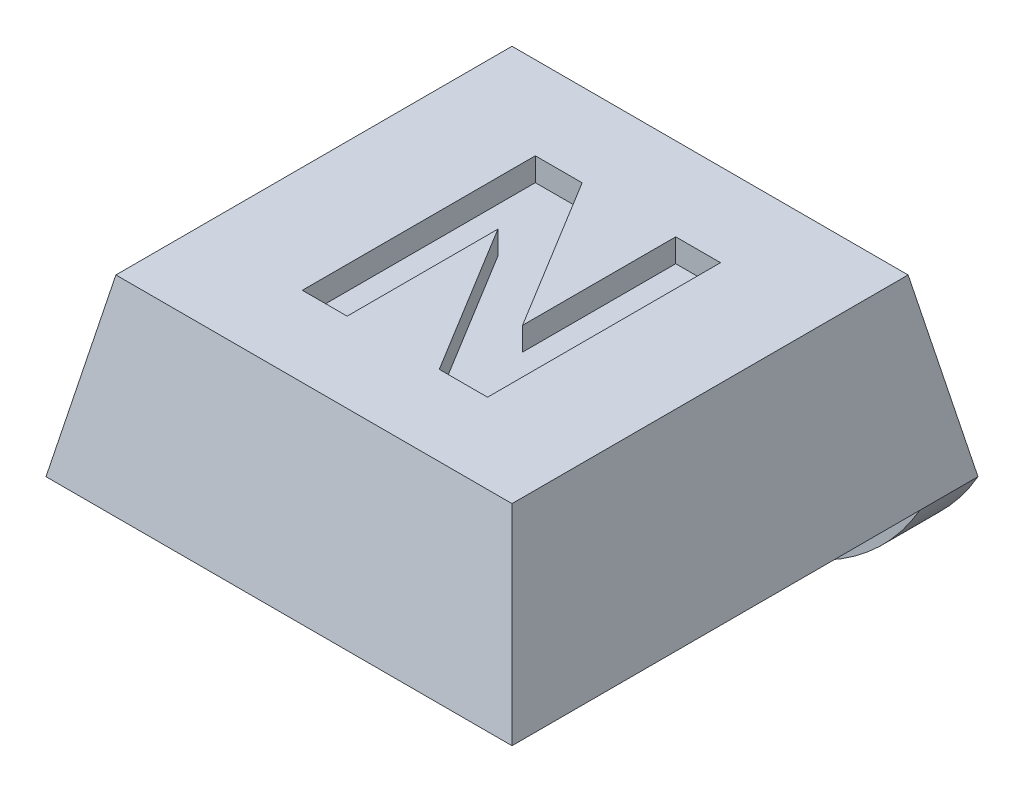
ISO-10303-21;
HEADER;
FILE_DESCRIPTION(('STEP AP214'),'2;1');
FILE_NAME('part.step','',(''),(''),'','','');
FILE_SCHEMA(('AUTOMOTIVE_DESIGN { 1 0 10303 214 1 1 1 1 }'));
ENDSEC;
DATA;
#1=APPLICATION_CONTEXT('core data for automotive mechanical design processes');
#2=APPLICATION_PROTOCOL_DEFINITION('international standard','automotive_design',2000,#1);
#3=PRODUCT_CONTEXT('',#1,'mechanical');
#4=PRODUCT('Part','Part','',(#3));
#5=PRODUCT_RELATED_PRODUCT_CATEGORY('part','',(#4));
#6=PRODUCT_DEFINITION_FORMATION('','',#4);
#7=PRODUCT_DEFINITION_CONTEXT('part definition',#1,'design');
#8=PRODUCT_DEFINITION('design','',#6,#7);
#9=PRODUCT_DEFINITION_SHAPE('','',#8);
#10=(LENGTH_UNIT() NAMED_UNIT(*) SI_UNIT(.MILLI.,.METRE.));
#11=(NAMED_UNIT(*) PLANE_ANGLE_UNIT() SI_UNIT($,.RADIAN.));
#12=(NAMED_UNIT(*) SI_UNIT($,.STERADIAN.) SOLID_ANGLE_UNIT());
#13=UNCERTAINTY_MEASURE_WITH_UNIT(LENGTH_MEASURE(1.E-05),#10,'distance_accuracy_value','');
#14=(GEOMETRIC_REPRESENTATION_CONTEXT(3) GLOBAL_UNCERTAINTY_ASSIGNED_CONTEXT((#13)) GLOBAL_UNIT_ASSIGNED_CONTEXT((#10,
#11,#12)) REPRESENTATION_CONTEXT('',''));
#15=CARTESIAN_POINT('',(0.,0.,0.));
#16=DIRECTION('',(0.,0.,1.));
#17=DIRECTION('',(1.,0.,0.));
#18=AXIS2_PLACEMENT_3D('',#15,#16,#17);
#19=CARTESIAN_POINT('',(0.,3.,0.));
#20=DIRECTION('',(0.,-1.,0.));
#21=DIRECTION('',(0.,0.,-1.));
#22=AXIS2_PLACEMENT_3D('',#19,#20,#21);
#23=PLANE('',#22);
#24=DIRECTION('',(-1.,0.,0.));
#25=VECTOR('',#24,1.);
#26=CARTESIAN_POINT('',(11.,3.,-0.6));
#27=LINE('',#26,#25);
#28=CARTESIAN_POINT('',(7.4,3.,-0.6));
#29=VERTEX_POINT('',#28);
#30=CARTESIAN_POINT('',(0.6,3.,-0.6));
#31=VERTEX_POINT('',#30);
#32=EDGE_CURVE('E217',#29,#31,#27,.T.);
#33=ORIENTED_EDGE('',*,*,#32,.F.);
#34=DIRECTION('',(0.,0.,1.));
#35=VECTOR('',#34,1.);
#36=CARTESIAN_POINT('',(7.4,3.,-8.));
#37=LINE('',#36,#35);
#38=CARTESIAN_POINT('',(7.4,3.,-7.4));
#39=VERTEX_POINT('',#38);
#40=EDGE_CURVE('E230',#39,#29,#37,.T.);
#41=ORIENTED_EDGE('',*,*,#40,.F.);
#42=DIRECTION('',(-1.,0.,0.));
#43=VECTOR('',#42,1.);
#44=CARTESIAN_POINT('',(11.,3.,-7.4));
#45=LINE('',#44,#43);
#46=CARTESIAN_POINT('',(0.599999999999999,3.,-7.4));
#47=VERTEX_POINT('',#46);
#48=EDGE_CURVE('E213',#39,#47,#45,.T.);
#49=ORIENTED_EDGE('',*,*,#48,.T.);
#50=DIRECTION('',(0.,0.,1.));
#51=VECTOR('',#50,1.);
#52=CARTESIAN_POINT('',(0.6,3.,-8.));
#53=LINE('',#52,#51);
#54=EDGE_CURVE('E233',#47,#31,#53,.T.);
#55=ORIENTED_EDGE('',*,*,#54,.T.);
#56=EDGE_LOOP('',(#33,#41,#49,#55));
#57=FACE_BOUND('',#56,.T.);
#58=DIRECTION('',(-1.,0.,0.));
#59=VECTOR('',#58,1.);
#60=CARTESIAN_POINT('',(3.19779277736189,3.,-1.9720128589146));
#61=LINE('',#60,#59);
#62=CARTESIAN_POINT('',(3.19779277736189,3.,-1.9720128589146));
#63=VERTEX_POINT('',#62);
#64=CARTESIAN_POINT('',(2.42856200813112,3.,-1.9720128589146));
#65=VERTEX_POINT('',#64);
#66=EDGE_CURVE('E58',#63,#65,#61,.T.);
#67=ORIENTED_EDGE('',*,*,#66,.T.);
#68=DIRECTION('',(0.,0.,-1.));
#69=VECTOR('',#68,1.);
#70=CARTESIAN_POINT('',(2.42856200813112,3.,-1.9720128589146));
#71=LINE('',#70,#69);
#72=CARTESIAN_POINT('',(2.42856200813112,3.,-5.9720128589146));
#73=VERTEX_POINT('',#72);
#74=EDGE_CURVE('E185',#65,#73,#71,.T.);
#75=ORIENTED_EDGE('',*,*,#74,.T.);
#76=DIRECTION('',(1.,0.,0.));
#77=VECTOR('',#76,1.);
#78=CARTESIAN_POINT('',(2.42856200813112,3.,-5.9720128589146));
#79=LINE('',#78,#77);
#80=CARTESIAN_POINT('',(3.23224790556701,3.,-5.9720128589146));
#81=VERTEX_POINT('',#80);
#82=EDGE_CURVE('E624',#73,#81,#79,.T.);
#83=ORIENTED_EDGE('',*,*,#82,.T.);
#84=DIRECTION('',(0.521323795742145,0.,0.853358951434274));
#85=VECTOR('',#84,1.);
#86=CARTESIAN_POINT('',(3.23224790556701,3.,-5.9720128589146));
#87=LINE('',#86,#85);
#88=CARTESIAN_POINT('',(4.83881841838753,3.,-3.34220516660691));
#89=VERTEX_POINT('',#88);
#90=EDGE_CURVE('E626',#81,#89,#87,.T.);
#91=ORIENTED_EDGE('',*,*,#90,.T.);
#92=DIRECTION('',(0.,0.,-1.));
#93=VECTOR('',#92,1.);
#94=CARTESIAN_POINT('',(4.83881841838753,3.,-3.34220516660691));
#95=LINE('',#94,#93);
#96=CARTESIAN_POINT('',(4.83881841838753,3.,-5.9720128589146));
#97=VERTEX_POINT('',#96);
#98=EDGE_CURVE('E631',#89,#97,#95,.T.);
#99=ORIENTED_EDGE('',*,*,#98,.T.);
#100=DIRECTION('',(1.,0.,0.));
#101=VECTOR('',#100,1.);
#102=CARTESIAN_POINT('',(4.83881841838753,3.,-5.9720128589146));
#103=LINE('',#102,#101);
#104=CARTESIAN_POINT('',(5.6080491876183,3.,-5.9720128589146));
#105=VERTEX_POINT('',#104);
#106=EDGE_CURVE('E641',#97,#105,#103,.T.);
#107=ORIENTED_EDGE('',*,*,#106,.T.);
#108=DIRECTION('',(0.,0.,1.));
#109=VECTOR('',#108,1.);
#110=CARTESIAN_POINT('',(5.6080491876183,3.,-5.9720128589146));
#111=LINE('',#110,#109);
#112=CARTESIAN_POINT('',(5.6080491876183,3.,-1.9720128589146));
#113=VERTEX_POINT('',#112);
#114=EDGE_CURVE('E596',#105,#113,#111,.T.);
#115=ORIENTED_EDGE('',*,*,#114,.T.);
#116=DIRECTION('',(-1.,0.,0.));
#117=VECTOR('',#116,1.);
#118=CARTESIAN_POINT('',(5.6080491876183,3.,-1.9720128589146));
#119=LINE('',#118,#117);
#120=CARTESIAN_POINT('',(4.77952354659266,3.,-1.9720128589146));
#121=VERTEX_POINT('',#120);
#122=EDGE_CURVE('E591',#113,#121,#119,.T.);
#123=ORIENTED_EDGE('',*,*,#122,.T.);
#124=DIRECTION('',(-0.521471380338423,0.,-0.853268773299445));
#125=VECTOR('',#124,1.);
#126=CARTESIAN_POINT('',(4.77952354659266,3.,-1.9720128589146));
#127=LINE('',#126,#125);
#128=CARTESIAN_POINT('',(3.19779277736189,3.,-4.56015388455563));
#129=VERTEX_POINT('',#128);
#130=EDGE_CURVE('E585',#121,#129,#127,.T.);
#131=ORIENTED_EDGE('',*,*,#130,.T.);
#132=DIRECTION('',(0.,0.,1.));
#133=VECTOR('',#132,1.);
#134=CARTESIAN_POINT('',(3.19779277736189,3.,-4.56015388455563));
#135=LINE('',#134,#133);
#136=EDGE_CURVE('E181',#129,#63,#135,.T.);
#137=ORIENTED_EDGE('',*,*,#136,.T.);
#138=EDGE_LOOP('',(#67,#75,#83,#91,#99,#107,#115,#123,#131,#137));
#139=FACE_BOUND('',#138,.T.);
#140=ADVANCED_FACE('F42',(#57,#139),#23,.F.);
#141=CARTESIAN_POINT('',(8.,0.,-8.));
#142=DIRECTION('',(-0.98058067569092,-0.196116135138184,0.));
#143=DIRECTION('',(0.196116135138184,-0.98058067569092,0.));
#144=AXIS2_PLACEMENT_3D('',#141,#142,#143);
#145=PLANE('',#144);
#146=DIRECTION('',(-0.192450089729875,0.962250448649376,-0.192450089729875));
#147=VECTOR('',#146,1.);
#148=CARTESIAN_POINT('',(7.7037037037037,1.48148148148148,-0.296296296296296));
#149=LINE('',#148,#147);
#150=CARTESIAN_POINT('',(8.,0.,0.));
#151=VERTEX_POINT('',#150);
#152=EDGE_CURVE('E227',#151,#29,#149,.T.);
#153=ORIENTED_EDGE('',*,*,#152,.F.);
#154=DIRECTION('',(0.,0.,-1.));
#155=VECTOR('',#154,1.);
#156=CARTESIAN_POINT('',(8.,0.,0.));
#157=LINE('',#156,#155);
#158=CARTESIAN_POINT('',(8.,0.,-7.));
#159=VERTEX_POINT('',#158);
#160=EDGE_CURVE('E246',#151,#159,#157,.T.);
#161=ORIENTED_EDGE('',*,*,#160,.T.);
#162=DIRECTION('',(0.,0.,1.));
#163=VECTOR('',#162,1.);
#164=CARTESIAN_POINT('',(8.,0.,-8.));
#165=LINE('',#164,#163);
#166=CARTESIAN_POINT('',(8.,0.,-8.));
#167=VERTEX_POINT('',#166);
#168=EDGE_CURVE('E187',#167,#159,#165,.T.);
#169=ORIENTED_EDGE('',*,*,#168,.F.);
#170=DIRECTION('',(0.192450089729875,-0.962250448649376,-0.192450089729875));
#171=VECTOR('',#170,1.);
#172=CARTESIAN_POINT('',(8.,0.,-8.));
#173=LINE('',#172,#171);
#174=EDGE_CURVE('E220',#39,#167,#173,.T.);
#175=ORIENTED_EDGE('',*,*,#174,.F.);
#176=ORIENTED_EDGE('',*,*,#40,.T.);
#177=EDGE_LOOP('',(#153,#161,#169,#175,#176));
#178=FACE_BOUND('',#177,.T.);
#179=ADVANCED_FACE('F314',(#178),#145,.F.);
#180=CARTESIAN_POINT('',(0.,0.,-8.));
#181=DIRECTION('',(0.98058067569092,-0.196116135138184,0.));
#182=DIRECTION('',(0.196116135138184,0.98058067569092,0.));
#183=AXIS2_PLACEMENT_3D('',#180,#181,#182);
#184=PLANE('',#183);
#185=DIRECTION('',(-0.192450089729875,-0.962250448649376,0.192450089729875));
#186=VECTOR('',#185,1.);
#187=CARTESIAN_POINT('',(0.296296296296296,1.48148148148148,-0.296296296296296));
#188=LINE('',#187,#186);
#189=CARTESIAN_POINT('',(0.,0.,0.));
#190=VERTEX_POINT('',#189);
#191=EDGE_CURVE('E274',#31,#190,#188,.T.);
#192=ORIENTED_EDGE('',*,*,#191,.F.);
#193=ORIENTED_EDGE('',*,*,#54,.F.);
#194=DIRECTION('',(0.192450089729875,0.962250448649376,0.192450089729875));
#195=VECTOR('',#194,1.);
#196=CARTESIAN_POINT('',(0.,0.,-8.));
#197=LINE('',#196,#195);
#198=CARTESIAN_POINT('',(0.,0.,-8.));
#199=VERTEX_POINT('',#198);
#200=EDGE_CURVE('E245',#199,#47,#197,.T.);
#201=ORIENTED_EDGE('',*,*,#200,.F.);
#202=DIRECTION('',(0.,0.,1.));
#203=VECTOR('',#202,1.);
#204=CARTESIAN_POINT('',(0.,0.,0.));
#205=LINE('',#204,#203);
#206=CARTESIAN_POINT('',(0.,0.,-7.));
#207=VERTEX_POINT('',#206);
#208=EDGE_CURVE('E250',#199,#207,#205,.T.);
#209=ORIENTED_EDGE('',*,*,#208,.T.);
#210=EDGE_CURVE('E237',#207,#190,#205,.T.);
#211=ORIENTED_EDGE('',*,*,#210,.T.);
#212=EDGE_LOOP('',(#192,#193,#201,#209,#211));
#213=FACE_BOUND('',#212,.T.);
#214=ADVANCED_FACE('F298',(#213),#184,.F.);
#215=CARTESIAN_POINT('',(0.,0.,0.));
#216=DIRECTION('',(0.,-1.,0.));
#217=DIRECTION('',(0.,0.,-1.));
#218=AXIS2_PLACEMENT_3D('',#215,#216,#217);
#219=PLANE('',#218);
#220=DIRECTION('',(-1.,0.,0.));
#221=VECTOR('',#220,1.);
#222=CARTESIAN_POINT('',(0.,0.,-7.));
#223=LINE('',#222,#221);
#224=EDGE_CURVE('E193',#159,#207,#223,.T.);
#225=ORIENTED_EDGE('',*,*,#224,.F.);
#226=ORIENTED_EDGE('',*,*,#160,.F.);
#227=DIRECTION('',(1.,0.,0.));
#228=VECTOR('',#227,1.);
#229=CARTESIAN_POINT('',(0.,0.,0.));
#230=LINE('',#229,#228);
#231=EDGE_CURVE('E247',#190,#151,#230,.T.);
#232=ORIENTED_EDGE('',*,*,#231,.F.);
#233=ORIENTED_EDGE('',*,*,#210,.F.);
#234=EDGE_LOOP('',(#225,#226,#232,#233));
#235=FACE_BOUND('',#234,.T.);
#236=CARTESIAN_POINT('',(4.,0.,-3.75));
#237=DIRECTION('',(0.,-1.,0.));
#238=DIRECTION('',(0.,0.,-1.));
#239=AXIS2_PLACEMENT_3D('',#236,#237,#238);
#240=CIRCLE('',#239,1.8);
#241=CARTESIAN_POINT('',(4.,0.,-5.55));
#242=VERTEX_POINT('',#241);
#243=EDGE_CURVE('E205',#242,#242,#240,.T.);
#244=ORIENTED_EDGE('',*,*,#243,.F.);
#245=EDGE_LOOP('',(#244));
#246=FACE_BOUND('',#245,.T.);
#247=ADVANCED_FACE('F309',(#235,#246),#219,.T.);
#248=CARTESIAN_POINT('',(11.,3.,-7.4));
#249=DIRECTION('',(0.,0.196116135138184,-0.98058067569092));
#250=DIRECTION('',(0.,0.98058067569092,0.196116135138184));
#251=AXIS2_PLACEMENT_3D('',#248,#249,#250);
#252=PLANE('',#251);
#253=ORIENTED_EDGE('',*,*,#174,.T.);
#254=DIRECTION('',(-1.,0.,0.));
#255=VECTOR('',#254,1.);
#256=CARTESIAN_POINT('',(0.,0.,-8.));
#257=LINE('',#256,#255);
#258=EDGE_CURVE('E241',#167,#199,#257,.T.);
#259=ORIENTED_EDGE('',*,*,#258,.T.);
#260=ORIENTED_EDGE('',*,*,#200,.T.);
#261=ORIENTED_EDGE('',*,*,#48,.F.);
#262=EDGE_LOOP('',(#253,#259,#260,#261));
#263=FACE_BOUND('',#262,.T.);
#264=ADVANCED_FACE('F293',(#263),#252,.T.);
#265=CARTESIAN_POINT('',(11.,0.,0.));
#266=DIRECTION('',(0.,0.196116135138184,0.98058067569092));
#267=DIRECTION('',(0.,-0.98058067569092,0.196116135138184));
#268=AXIS2_PLACEMENT_3D('',#265,#266,#267);
#269=PLANE('',#268);
#270=ORIENTED_EDGE('',*,*,#152,.T.);
#271=ORIENTED_EDGE('',*,*,#32,.T.);
#272=ORIENTED_EDGE('',*,*,#191,.T.);
#273=ORIENTED_EDGE('',*,*,#231,.T.);
#274=EDGE_LOOP('',(#270,#271,#272,#273));
#275=FACE_BOUND('',#274,.T.);
#276=ADVANCED_FACE('F340',(#275),#269,.T.);
#277=CARTESIAN_POINT('',(4.,0.8,-3.75));
#278=DIRECTION('',(0.,-1.,0.));
#279=DIRECTION('',(0.,0.,-1.));
#280=AXIS2_PLACEMENT_3D('',#277,#278,#279);
#281=CYLINDRICAL_SURFACE('',#280,1.8);
#282=CARTESIAN_POINT('',(4.,0.8,-3.75));
#283=DIRECTION('',(0.,-1.,0.));
#284=DIRECTION('',(0.,0.,-1.));
#285=AXIS2_PLACEMENT_3D('',#282,#283,#284);
#286=CIRCLE('',#285,1.8);
#287=CARTESIAN_POINT('',(4.,0.8,-5.55));
#288=VERTEX_POINT('',#287);
#289=EDGE_CURVE('E209',#288,#288,#286,.T.);
#290=ORIENTED_EDGE('',*,*,#289,.F.);
#291=EDGE_LOOP('',(#290));
#292=FACE_BOUND('',#291,.T.);
#293=ORIENTED_EDGE('',*,*,#243,.T.);
#294=EDGE_LOOP('',(#293));
#295=FACE_BOUND('',#294,.T.);
#296=ADVANCED_FACE('F347',(#292,#295),#281,.F.);
#297=CARTESIAN_POINT('',(4.,0.8,-3.75));
#298=DIRECTION('',(0.,-1.,0.));
#299=DIRECTION('',(0.,0.,-1.));
#300=AXIS2_PLACEMENT_3D('',#297,#298,#299);
#301=PLANE('',#300);
#302=ORIENTED_EDGE('',*,*,#289,.T.);
#303=EDGE_LOOP('',(#302));
#304=FACE_BOUND('',#303,.T.);
#305=ADVANCED_FACE('F351',(#304),#301,.T.);
#306=CARTESIAN_POINT('',(0.,-2.,-8.));
#307=DIRECTION('',(0.,0.,1.));
#308=DIRECTION('',(1.,0.,0.));
#309=AXIS2_PLACEMENT_3D('',#306,#307,#308);
#310=PLANE('',#309);
#311=ORIENTED_EDGE('',*,*,#258,.F.);
#312=CARTESIAN_POINT('',(4.53589838486225,2.,-8.));
#313=DIRECTION('',(0.,0.,1.));
#314=DIRECTION('',(1.,0.,0.));
#315=AXIS2_PLACEMENT_3D('',#312,#313,#314);
#316=CIRCLE('',#315,4.);
#317=CARTESIAN_POINT('',(4.53589838486225,-2.,-8.));
#318=VERTEX_POINT('',#317);
#319=EDGE_CURVE('E11',#167,#318,#316,.F.);
#320=ORIENTED_EDGE('',*,*,#319,.T.);
#321=DIRECTION('',(1.,0.,0.));
#322=VECTOR('',#321,1.);
#323=CARTESIAN_POINT('',(0.,-2.,-8.));
#324=LINE('',#323,#322);
#325=CARTESIAN_POINT('',(3.46410161513775,-2.,-8.));
#326=VERTEX_POINT('',#325);
#327=EDGE_CURVE('E199',#326,#318,#324,.T.);
#328=ORIENTED_EDGE('',*,*,#327,.F.);
#329=CARTESIAN_POINT('',(3.46410161513775,2.,-8.));
#330=DIRECTION('',(0.,0.,1.));
#331=DIRECTION('',(1.,0.,0.));
#332=AXIS2_PLACEMENT_3D('',#329,#330,#331);
#333=CIRCLE('',#332,4.);
#334=EDGE_CURVE('E51',#326,#199,#333,.F.);
#335=ORIENTED_EDGE('',*,*,#334,.T.);
#336=EDGE_LOOP('',(#311,#320,#328,#335));
#337=FACE_BOUND('',#336,.T.);
#338=ADVANCED_FACE('F286',(#337),#310,.F.);
#339=CARTESIAN_POINT('',(0.,-2.,-7.));
#340=DIRECTION('',(0.,0.,-1.));
#341=DIRECTION('',(-1.,0.,0.));
#342=AXIS2_PLACEMENT_3D('',#339,#340,#341);
#343=PLANE('',#342);
#344=DIRECTION('',(-1.,0.,0.));
#345=VECTOR('',#344,1.);
#346=CARTESIAN_POINT('',(0.,-2.,-7.));
#347=LINE('',#346,#345);
#348=CARTESIAN_POINT('',(4.53589838486225,-2.,-7.));
#349=VERTEX_POINT('',#348);
#350=CARTESIAN_POINT('',(3.46410161513775,-2.,-7.));
#351=VERTEX_POINT('',#350);
#352=EDGE_CURVE('E203',#349,#351,#347,.T.);
#353=ORIENTED_EDGE('',*,*,#352,.F.);
#354=CARTESIAN_POINT('',(4.53589838486225,2.,-7.));
#355=DIRECTION('',(0.,0.,-1.));
#356=DIRECTION('',(-1.,0.,0.));
#357=AXIS2_PLACEMENT_3D('',#354,#355,#356);
#358=CIRCLE('',#357,4.);
#359=EDGE_CURVE('E280',#349,#159,#358,.F.);
#360=ORIENTED_EDGE('',*,*,#359,.T.);
#361=ORIENTED_EDGE('',*,*,#224,.T.);
#362=CARTESIAN_POINT('',(3.46410161513775,2.,-7.));
#363=DIRECTION('',(0.,0.,-1.));
#364=DIRECTION('',(-1.,0.,0.));
#365=AXIS2_PLACEMENT_3D('',#362,#363,#364);
#366=CIRCLE('',#365,4.);
#367=EDGE_CURVE('E66',#207,#351,#366,.F.);
#368=ORIENTED_EDGE('',*,*,#367,.T.);
#369=EDGE_LOOP('',(#353,#360,#361,#368));
#370=FACE_BOUND('',#369,.T.);
#371=ADVANCED_FACE('F304',(#370),#343,.F.);
#372=CARTESIAN_POINT('',(0.,-2.,0.));
#373=DIRECTION('',(0.,1.,0.));
#374=DIRECTION('',(0.,0.,1.));
#375=AXIS2_PLACEMENT_3D('',#372,#373,#374);
#376=PLANE('',#375);
#377=ORIENTED_EDGE('',*,*,#327,.T.);
#378=DIRECTION('',(0.,0.,1.));
#379=VECTOR('',#378,1.);
#380=CARTESIAN_POINT('',(4.53589838486225,-2.,0.));
#381=LINE('',#380,#379);
#382=EDGE_CURVE('E273',#318,#349,#381,.T.);
#383=ORIENTED_EDGE('',*,*,#382,.T.);
#384=ORIENTED_EDGE('',*,*,#352,.T.);
#385=DIRECTION('',(0.,0.,-1.));
#386=VECTOR('',#385,1.);
#387=CARTESIAN_POINT('',(3.46410161513775,-2.,0.));
#388=LINE('',#387,#386);
#389=EDGE_CURVE('E269',#351,#326,#388,.T.);
#390=ORIENTED_EDGE('',*,*,#389,.T.);
#391=EDGE_LOOP('',(#377,#383,#384,#390));
#392=FACE_BOUND('',#391,.T.);
#393=ADVANCED_FACE('F302',(#392),#376,.F.);
#394=CARTESIAN_POINT('',(4.53589838486225,2.,-8.));
#395=DIRECTION('',(0.,0.,1.));
#396=DIRECTION('',(1.,0.,0.));
#397=AXIS2_PLACEMENT_3D('',#394,#395,#396);
#398=CYLINDRICAL_SURFACE('',#397,4.);
#399=ORIENTED_EDGE('',*,*,#319,.F.);
#400=ORIENTED_EDGE('',*,*,#168,.T.);
#401=ORIENTED_EDGE('',*,*,#359,.F.);
#402=ORIENTED_EDGE('',*,*,#382,.F.);
#403=EDGE_LOOP('',(#399,#400,#401,#402));
#404=FACE_BOUND('',#403,.T.);
#405=ADVANCED_FACE('F315',(#404),#398,.T.);
#406=CARTESIAN_POINT('',(3.46410161513775,2.,-8.));
#407=DIRECTION('',(0.,0.,-1.));
#408=DIRECTION('',(-1.,0.,0.));
#409=AXIS2_PLACEMENT_3D('',#406,#407,#408);
#410=CYLINDRICAL_SURFACE('',#409,4.);
#411=ORIENTED_EDGE('',*,*,#367,.F.);
#412=ORIENTED_EDGE('',*,*,#208,.F.);
#413=ORIENTED_EDGE('',*,*,#334,.F.);
#414=ORIENTED_EDGE('',*,*,#389,.F.);
#415=EDGE_LOOP('',(#411,#412,#413,#414));
#416=FACE_BOUND('',#415,.T.);
#417=ADVANCED_FACE('F44',(#416),#410,.T.);
#418=CARTESIAN_POINT('',(3.19779277736189,2.6,-1.9720128589146));
#419=DIRECTION('',(0.,0.,-1.));
#420=DIRECTION('',(-1.,0.,0.));
#421=AXIS2_PLACEMENT_3D('',#418,#419,#420);
#422=PLANE('',#421);
#423=ORIENTED_EDGE('',*,*,#66,.F.);
#424=DIRECTION('',(0.,1.,0.));
#425=VECTOR('',#424,1.);
#426=CARTESIAN_POINT('',(3.19779277736189,2.6,-1.9720128589146));
#427=LINE('',#426,#425);
#428=CARTESIAN_POINT('',(3.19779277736189,2.6,-1.9720128589146));
#429=VERTEX_POINT('',#428);
#430=EDGE_CURVE('E179',#429,#63,#427,.T.);
#431=ORIENTED_EDGE('',*,*,#430,.F.);
#432=DIRECTION('',(-1.,0.,0.));
#433=VECTOR('',#432,1.);
#434=CARTESIAN_POINT('',(3.19779277736189,2.6,-1.9720128589146));
#435=LINE('',#434,#433);
#436=CARTESIAN_POINT('',(2.42856200813112,2.6,-1.9720128589146));
#437=VERTEX_POINT('',#436);
#438=EDGE_CURVE('E169',#429,#437,#435,.T.);
#439=ORIENTED_EDGE('',*,*,#438,.T.);
#440=DIRECTION('',(0.,1.,0.));
#441=VECTOR('',#440,1.);
#442=CARTESIAN_POINT('',(2.42856200813112,2.6,-1.9720128589146));
#443=LINE('',#442,#441);
#444=EDGE_CURVE('E178',#437,#65,#443,.T.);
#445=ORIENTED_EDGE('',*,*,#444,.T.);
#446=EDGE_LOOP('',(#423,#431,#439,#445));
#447=FACE_BOUND('',#446,.T.);
#448=ADVANCED_FACE('F177',(#447),#422,.T.);
#449=CARTESIAN_POINT('',(2.42856200813112,2.6,-1.9720128589146));
#450=DIRECTION('',(1.,0.,0.));
#451=DIRECTION('',(0.,0.,-1.));
#452=AXIS2_PLACEMENT_3D('',#449,#450,#451);
#453=PLANE('',#452);
#454=ORIENTED_EDGE('',*,*,#74,.F.);
#455=ORIENTED_EDGE('',*,*,#444,.F.);
#456=DIRECTION('',(0.,0.,-1.));
#457=VECTOR('',#456,1.);
#458=CARTESIAN_POINT('',(2.42856200813112,2.6,-1.9720128589146));
#459=LINE('',#458,#457);
#460=CARTESIAN_POINT('',(2.42856200813112,2.6,-5.9720128589146));
#461=VERTEX_POINT('',#460);
#462=EDGE_CURVE('E165',#437,#461,#459,.T.);
#463=ORIENTED_EDGE('',*,*,#462,.T.);
#464=DIRECTION('',(0.,1.,0.));
#465=VECTOR('',#464,1.);
#466=CARTESIAN_POINT('',(2.42856200813112,2.6,-5.9720128589146));
#467=LINE('',#466,#465);
#468=EDGE_CURVE('E188',#461,#73,#467,.T.);
#469=ORIENTED_EDGE('',*,*,#468,.T.);
#470=EDGE_LOOP('',(#454,#455,#463,#469));
#471=FACE_BOUND('',#470,.T.);
#472=ADVANCED_FACE('F183',(#471),#453,.T.);
#473=CARTESIAN_POINT('',(2.42856200813112,2.6,-5.9720128589146));
#474=DIRECTION('',(0.,0.,1.));
#475=DIRECTION('',(1.,0.,0.));
#476=AXIS2_PLACEMENT_3D('',#473,#474,#475);
#477=PLANE('',#476);
#478=ORIENTED_EDGE('',*,*,#82,.F.);
#479=ORIENTED_EDGE('',*,*,#468,.F.);
#480=DIRECTION('',(1.,0.,0.));
#481=VECTOR('',#480,1.);
#482=CARTESIAN_POINT('',(2.42856200813112,2.6,-5.9720128589146));
#483=LINE('',#482,#481);
#484=CARTESIAN_POINT('',(3.23224790556701,2.6,-5.9720128589146));
#485=VERTEX_POINT('',#484);
#486=EDGE_CURVE('E171',#461,#485,#483,.T.);
#487=ORIENTED_EDGE('',*,*,#486,.T.);
#488=DIRECTION('',(0.,1.,0.));
#489=VECTOR('',#488,1.);
#490=CARTESIAN_POINT('',(3.23224790556701,2.6,-5.9720128589146));
#491=LINE('',#490,#489);
#492=EDGE_CURVE('E195',#485,#81,#491,.T.);
#493=ORIENTED_EDGE('',*,*,#492,.T.);
#494=EDGE_LOOP('',(#478,#479,#487,#493));
#495=FACE_BOUND('',#494,.T.);
#496=ADVANCED_FACE('F364',(#495),#477,.T.);
#497=CARTESIAN_POINT('',(3.23224790556701,2.6,-5.9720128589146));
#498=DIRECTION('',(-0.853358951434274,0.,0.521323795742145));
#499=DIRECTION('',(0.521323795742145,0.,0.853358951434274));
#500=AXIS2_PLACEMENT_3D('',#497,#498,#499);
#501=PLANE('',#500);
#502=ORIENTED_EDGE('',*,*,#90,.F.);
#503=ORIENTED_EDGE('',*,*,#492,.F.);
#504=DIRECTION('',(0.521323795742145,0.,0.853358951434274));
#505=VECTOR('',#504,1.);
#506=CARTESIAN_POINT('',(3.23224790556701,2.6,-5.9720128589146));
#507=LINE('',#506,#505);
#508=CARTESIAN_POINT('',(4.83881841838753,2.6,-3.34220516660691));
#509=VERTEX_POINT('',#508);
#510=EDGE_CURVE('E671',#485,#509,#507,.T.);
#511=ORIENTED_EDGE('',*,*,#510,.T.);
#512=DIRECTION('',(0.,1.,0.));
#513=VECTOR('',#512,1.);
#514=CARTESIAN_POINT('',(4.83881841838753,2.6,-3.34220516660691));
#515=LINE('',#514,#513);
#516=EDGE_CURVE('E617',#509,#89,#515,.T.);
#517=ORIENTED_EDGE('',*,*,#516,.T.);
#518=EDGE_LOOP('',(#502,#503,#511,#517));
#519=FACE_BOUND('',#518,.T.);
#520=ADVANCED_FACE('F367',(#519),#501,.T.);
#521=CARTESIAN_POINT('',(4.83881841838753,2.6,-3.34220516660691));
#522=DIRECTION('',(1.,0.,0.));
#523=DIRECTION('',(0.,0.,-1.));
#524=AXIS2_PLACEMENT_3D('',#521,#522,#523);
#525=PLANE('',#524);
#526=ORIENTED_EDGE('',*,*,#98,.F.);
#527=ORIENTED_EDGE('',*,*,#516,.F.);
#528=DIRECTION('',(0.,0.,-1.));
#529=VECTOR('',#528,1.);
#530=CARTESIAN_POINT('',(4.83881841838753,2.6,-3.34220516660691));
#531=LINE('',#530,#529);
#532=CARTESIAN_POINT('',(4.83881841838753,2.6,-5.9720128589146));
#533=VERTEX_POINT('',#532);
#534=EDGE_CURVE('E668',#509,#533,#531,.T.);
#535=ORIENTED_EDGE('',*,*,#534,.T.);
#536=DIRECTION('',(0.,1.,0.));
#537=VECTOR('',#536,1.);
#538=CARTESIAN_POINT('',(4.83881841838753,2.6,-5.9720128589146));
#539=LINE('',#538,#537);
#540=EDGE_CURVE('E614',#533,#97,#539,.T.);
#541=ORIENTED_EDGE('',*,*,#540,.T.);
#542=EDGE_LOOP('',(#526,#527,#535,#541));
#543=FACE_BOUND('',#542,.T.);
#544=ADVANCED_FACE('F371',(#543),#525,.T.);
#545=CARTESIAN_POINT('',(4.83881841838753,2.6,-5.9720128589146));
#546=DIRECTION('',(0.,0.,1.));
#547=DIRECTION('',(1.,0.,0.));
#548=AXIS2_PLACEMENT_3D('',#545,#546,#547);
#549=PLANE('',#548);
#550=ORIENTED_EDGE('',*,*,#106,.F.);
#551=ORIENTED_EDGE('',*,*,#540,.F.);
#552=DIRECTION('',(1.,0.,0.));
#553=VECTOR('',#552,1.);
#554=CARTESIAN_POINT('',(4.83881841838753,2.6,-5.9720128589146));
#555=LINE('',#554,#553);
#556=CARTESIAN_POINT('',(5.6080491876183,2.6,-5.9720128589146));
#557=VERTEX_POINT('',#556);
#558=EDGE_CURVE('E665',#533,#557,#555,.T.);
#559=ORIENTED_EDGE('',*,*,#558,.T.);
#560=DIRECTION('',(0.,1.,0.));
#561=VECTOR('',#560,1.);
#562=CARTESIAN_POINT('',(5.6080491876183,2.6,-5.9720128589146));
#563=LINE('',#562,#561);
#564=EDGE_CURVE('E611',#557,#105,#563,.T.);
#565=ORIENTED_EDGE('',*,*,#564,.T.);
#566=EDGE_LOOP('',(#550,#551,#559,#565));
#567=FACE_BOUND('',#566,.T.);
#568=ADVANCED_FACE('F375',(#567),#549,.T.);
#569=CARTESIAN_POINT('',(5.6080491876183,2.6,-5.9720128589146));
#570=DIRECTION('',(-1.,0.,0.));
#571=DIRECTION('',(0.,0.,1.));
#572=AXIS2_PLACEMENT_3D('',#569,#570,#571);
#573=PLANE('',#572);
#574=ORIENTED_EDGE('',*,*,#114,.F.);
#575=ORIENTED_EDGE('',*,*,#564,.F.);
#576=DIRECTION('',(0.,0.,1.));
#577=VECTOR('',#576,1.);
#578=CARTESIAN_POINT('',(5.6080491876183,2.6,-5.9720128589146));
#579=LINE('',#578,#577);
#580=CARTESIAN_POINT('',(5.6080491876183,2.6,-1.9720128589146));
#581=VERTEX_POINT('',#580);
#582=EDGE_CURVE('E650',#557,#581,#579,.T.);
#583=ORIENTED_EDGE('',*,*,#582,.T.);
#584=DIRECTION('',(0.,1.,0.));
#585=VECTOR('',#584,1.);
#586=CARTESIAN_POINT('',(5.6080491876183,2.6,-1.9720128589146));
#587=LINE('',#586,#585);
#588=EDGE_CURVE('E608',#581,#113,#587,.T.);
#589=ORIENTED_EDGE('',*,*,#588,.T.);
#590=EDGE_LOOP('',(#574,#575,#583,#589));
#591=FACE_BOUND('',#590,.T.);
#592=ADVANCED_FACE('F379',(#591),#573,.T.);
#593=CARTESIAN_POINT('',(5.6080491876183,2.6,-1.9720128589146));
#594=DIRECTION('',(0.,0.,-1.));
#595=DIRECTION('',(-1.,0.,0.));
#596=AXIS2_PLACEMENT_3D('',#593,#594,#595);
#597=PLANE('',#596);
#598=ORIENTED_EDGE('',*,*,#122,.F.);
#599=ORIENTED_EDGE('',*,*,#588,.F.);
#600=DIRECTION('',(-1.,0.,0.));
#601=VECTOR('',#600,1.);
#602=CARTESIAN_POINT('',(5.6080491876183,2.6,-1.9720128589146));
#603=LINE('',#602,#601);
#604=CARTESIAN_POINT('',(4.77952354659266,2.6,-1.9720128589146));
#605=VERTEX_POINT('',#604);
#606=EDGE_CURVE('E652',#581,#605,#603,.T.);
#607=ORIENTED_EDGE('',*,*,#606,.T.);
#608=DIRECTION('',(0.,1.,0.));
#609=VECTOR('',#608,1.);
#610=CARTESIAN_POINT('',(4.77952354659266,2.6,-1.9720128589146));
#611=LINE('',#610,#609);
#612=EDGE_CURVE('E605',#605,#121,#611,.T.);
#613=ORIENTED_EDGE('',*,*,#612,.T.);
#614=EDGE_LOOP('',(#598,#599,#607,#613));
#615=FACE_BOUND('',#614,.T.);
#616=ADVANCED_FACE('F383',(#615),#597,.T.);
#617=CARTESIAN_POINT('',(4.77952354659266,2.6,-1.9720128589146));
#618=DIRECTION('',(0.853268773299445,0.,-0.521471380338423));
#619=DIRECTION('',(-0.521471380338423,0.,-0.853268773299445));
#620=AXIS2_PLACEMENT_3D('',#617,#618,#619);
#621=PLANE('',#620);
#622=ORIENTED_EDGE('',*,*,#130,.F.);
#623=ORIENTED_EDGE('',*,*,#612,.F.);
#624=DIRECTION('',(-0.521471380338423,0.,-0.853268773299445));
#625=VECTOR('',#624,1.);
#626=CARTESIAN_POINT('',(4.77952354659266,2.6,-1.9720128589146));
#627=LINE('',#626,#625);
#628=CARTESIAN_POINT('',(3.19779277736189,2.6,-4.56015388455563));
#629=VERTEX_POINT('',#628);
#630=EDGE_CURVE('E654',#605,#629,#627,.T.);
#631=ORIENTED_EDGE('',*,*,#630,.T.);
#632=DIRECTION('',(0.,1.,0.));
#633=VECTOR('',#632,1.);
#634=CARTESIAN_POINT('',(3.19779277736189,2.6,-4.56015388455563));
#635=LINE('',#634,#633);
#636=EDGE_CURVE('E583',#629,#129,#635,.T.);
#637=ORIENTED_EDGE('',*,*,#636,.T.);
#638=EDGE_LOOP('',(#622,#623,#631,#637));
#639=FACE_BOUND('',#638,.T.);
#640=ADVANCED_FACE('F387',(#639),#621,.T.);
#641=CARTESIAN_POINT('',(3.19779277736189,2.6,-4.56015388455563));
#642=DIRECTION('',(-1.,0.,0.));
#643=DIRECTION('',(0.,0.,1.));
#644=AXIS2_PLACEMENT_3D('',#641,#642,#643);
#645=PLANE('',#644);
#646=ORIENTED_EDGE('',*,*,#136,.F.);
#647=ORIENTED_EDGE('',*,*,#636,.F.);
#648=DIRECTION('',(0.,0.,1.));
#649=VECTOR('',#648,1.);
#650=CARTESIAN_POINT('',(3.19779277736189,2.6,-4.56015388455563));
#651=LINE('',#650,#649);
#652=EDGE_CURVE('E602',#629,#429,#651,.T.);
#653=ORIENTED_EDGE('',*,*,#652,.T.);
#654=ORIENTED_EDGE('',*,*,#430,.T.);
#655=EDGE_LOOP('',(#646,#647,#653,#654));
#656=FACE_BOUND('',#655,.T.);
#657=ADVANCED_FACE('F391',(#656),#645,.T.);
#658=CARTESIAN_POINT('',(0.,2.6,0.));
#659=DIRECTION('',(0.,-1.,0.));
#660=DIRECTION('',(0.,0.,-1.));
#661=AXIS2_PLACEMENT_3D('',#658,#659,#660);
#662=PLANE('',#661);
#663=ORIENTED_EDGE('',*,*,#438,.F.);
#664=ORIENTED_EDGE('',*,*,#652,.F.);
#665=ORIENTED_EDGE('',*,*,#630,.F.);
#666=ORIENTED_EDGE('',*,*,#606,.F.);
#667=ORIENTED_EDGE('',*,*,#582,.F.);
#668=ORIENTED_EDGE('',*,*,#558,.F.);
#669=ORIENTED_EDGE('',*,*,#534,.F.);
#670=ORIENTED_EDGE('',*,*,#510,.F.);
#671=ORIENTED_EDGE('',*,*,#486,.F.);
#672=ORIENTED_EDGE('',*,*,#462,.F.);
#673=EDGE_LOOP('',(#663,#664,#665,#666,#667,#668,#669,#670,#671,#672));
#674=FACE_BOUND('',#673,.T.);
#675=ADVANCED_FACE('F167',(#674),#662,.F.);
#676=CLOSED_SHELL('',(#140,#179,#214,#247,#264,#276,#296,#305,#338,#371,#393,#405,#417,#448,
#472,#496,#520,#544,#568,#592,#616,#640,#657,#675));
#677=MANIFOLD_SOLID_BREP('B2',#676);
#678=ADVANCED_BREP_SHAPE_REPRESENTATION('',(#18,#677),#14);
#679=SHAPE_DEFINITION_REPRESENTATION(#9,#678);
ENDSEC;
END-ISO-10303-21;
